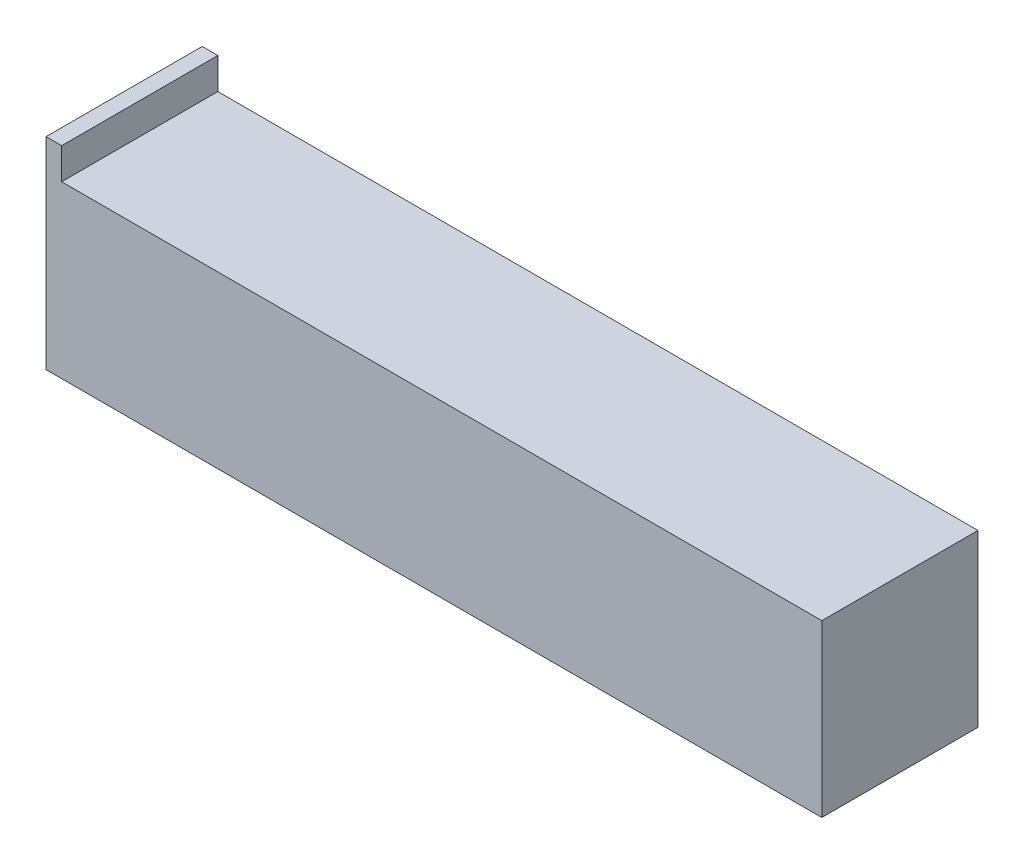
ISO-10303-21;
HEADER;
FILE_DESCRIPTION(('STEP AP214'),'2;1');
FILE_NAME('part.step','',(''),(''),'','','');
FILE_SCHEMA(('AUTOMOTIVE_DESIGN { 1 0 10303 214 1 1 1 1 }'));
ENDSEC;
DATA;
#1=APPLICATION_CONTEXT('core data for automotive mechanical design processes');
#2=APPLICATION_PROTOCOL_DEFINITION('international standard','automotive_design',2000,#1);
#3=PRODUCT_CONTEXT('',#1,'mechanical');
#4=PRODUCT('Part','Part','',(#3));
#5=PRODUCT_RELATED_PRODUCT_CATEGORY('part','',(#4));
#6=PRODUCT_DEFINITION_FORMATION('','',#4);
#7=PRODUCT_DEFINITION_CONTEXT('part definition',#1,'design');
#8=PRODUCT_DEFINITION('design','',#6,#7);
#9=PRODUCT_DEFINITION_SHAPE('','',#8);
#10=(LENGTH_UNIT() NAMED_UNIT(*) SI_UNIT(.MILLI.,.METRE.));
#11=(NAMED_UNIT(*) PLANE_ANGLE_UNIT() SI_UNIT($,.RADIAN.));
#12=(NAMED_UNIT(*) SI_UNIT($,.STERADIAN.) SOLID_ANGLE_UNIT());
#13=UNCERTAINTY_MEASURE_WITH_UNIT(LENGTH_MEASURE(1.E-05),#10,'distance_accuracy_value','');
#14=(GEOMETRIC_REPRESENTATION_CONTEXT(3) GLOBAL_UNCERTAINTY_ASSIGNED_CONTEXT((#13)) GLOBAL_UNIT_ASSIGNED_CONTEXT((#10,
#11,#12)) REPRESENTATION_CONTEXT('',''));
#15=CARTESIAN_POINT('',(0.,0.,0.));
#16=DIRECTION('',(0.,0.,1.));
#17=DIRECTION('',(1.,0.,0.));
#18=AXIS2_PLACEMENT_3D('',#15,#16,#17);
#19=CARTESIAN_POINT('',(75.692,0.,15.24));
#20=DIRECTION('',(1.,0.,0.));
#21=DIRECTION('',(0.,0.,-1.));
#22=AXIS2_PLACEMENT_3D('',#19,#20,#21);
#23=PLANE('',#22);
#24=DIRECTION('',(0.,-1.,0.));
#25=VECTOR('',#24,1.);
#26=CARTESIAN_POINT('',(75.692,0.,0.));
#27=LINE('',#26,#25);
#28=CARTESIAN_POINT('',(75.692,0.,0.));
#29=VERTEX_POINT('',#28);
#30=CARTESIAN_POINT('',(75.692,-16.637,0.));
#31=VERTEX_POINT('',#30);
#32=EDGE_CURVE('E119',#29,#31,#27,.T.);
#33=ORIENTED_EDGE('',*,*,#32,.F.);
#34=DIRECTION('',(0.,0.,-1.));
#35=VECTOR('',#34,1.);
#36=CARTESIAN_POINT('',(75.692,0.,15.24));
#37=LINE('',#36,#35);
#38=CARTESIAN_POINT('',(75.692,0.,15.24));
#39=VERTEX_POINT('',#38);
#40=EDGE_CURVE('E11',#39,#29,#37,.T.);
#41=ORIENTED_EDGE('',*,*,#40,.F.);
#42=DIRECTION('',(0.,-1.,0.));
#43=VECTOR('',#42,1.);
#44=CARTESIAN_POINT('',(75.692,0.,15.24));
#45=LINE('',#44,#43);
#46=CARTESIAN_POINT('',(75.692,-16.637,15.24));
#47=VERTEX_POINT('',#46);
#48=EDGE_CURVE('E132',#39,#47,#45,.T.);
#49=ORIENTED_EDGE('',*,*,#48,.T.);
#50=DIRECTION('',(0.,0.,-1.));
#51=VECTOR('',#50,1.);
#52=CARTESIAN_POINT('',(75.692,-16.637,15.24));
#53=LINE('',#52,#51);
#54=EDGE_CURVE('E81',#47,#31,#53,.T.);
#55=ORIENTED_EDGE('',*,*,#54,.T.);
#56=EDGE_LOOP('',(#33,#41,#49,#55));
#57=FACE_BOUND('',#56,.T.);
#58=ADVANCED_FACE('F37',(#57),#23,.T.);
#59=CARTESIAN_POINT('',(0.,0.,15.24));
#60=DIRECTION('',(0.,1.,0.));
#61=DIRECTION('',(0.,0.,1.));
#62=AXIS2_PLACEMENT_3D('',#59,#60,#61);
#63=PLANE('',#62);
#64=DIRECTION('',(1.,0.,0.));
#65=VECTOR('',#64,1.);
#66=CARTESIAN_POINT('',(0.,0.,0.));
#67=LINE('',#66,#65);
#68=CARTESIAN_POINT('',(1.524,0.,0.));
#69=VERTEX_POINT('',#68);
#70=EDGE_CURVE('E122',#69,#29,#67,.T.);
#71=ORIENTED_EDGE('',*,*,#70,.F.);
#72=DIRECTION('',(0.,0.,-1.));
#73=VECTOR('',#72,1.);
#74=CARTESIAN_POINT('',(1.524,0.,15.24));
#75=LINE('',#74,#73);
#76=CARTESIAN_POINT('',(1.524,0.,15.24));
#77=VERTEX_POINT('',#76);
#78=EDGE_CURVE('E45',#77,#69,#75,.T.);
#79=ORIENTED_EDGE('',*,*,#78,.F.);
#80=DIRECTION('',(1.,0.,0.));
#81=VECTOR('',#80,1.);
#82=CARTESIAN_POINT('',(0.,0.,15.24));
#83=LINE('',#82,#81);
#84=EDGE_CURVE('E114',#77,#39,#83,.T.);
#85=ORIENTED_EDGE('',*,*,#84,.T.);
#86=ORIENTED_EDGE('',*,*,#40,.T.);
#87=EDGE_LOOP('',(#71,#79,#85,#86));
#88=FACE_BOUND('',#87,.T.);
#89=ADVANCED_FACE('F143',(#88),#63,.T.);
#90=CARTESIAN_POINT('',(1.524,0.,15.24));
#91=DIRECTION('',(-1.,0.,0.));
#92=DIRECTION('',(0.,0.,1.));
#93=AXIS2_PLACEMENT_3D('',#90,#91,#92);
#94=PLANE('',#93);
#95=DIRECTION('',(0.,1.,0.));
#96=VECTOR('',#95,1.);
#97=CARTESIAN_POINT('',(1.524,0.,0.));
#98=LINE('',#97,#96);
#99=CARTESIAN_POINT('',(1.524,3.048,0.));
#100=VERTEX_POINT('',#99);
#101=EDGE_CURVE('E125',#69,#100,#98,.T.);
#102=ORIENTED_EDGE('',*,*,#101,.T.);
#103=DIRECTION('',(0.,0.,-1.));
#104=VECTOR('',#103,1.);
#105=CARTESIAN_POINT('',(1.524,3.048,15.24));
#106=LINE('',#105,#104);
#107=CARTESIAN_POINT('',(1.524,3.048,15.24));
#108=VERTEX_POINT('',#107);
#109=EDGE_CURVE('E102',#108,#100,#106,.T.);
#110=ORIENTED_EDGE('',*,*,#109,.F.);
#111=DIRECTION('',(0.,1.,0.));
#112=VECTOR('',#111,1.);
#113=CARTESIAN_POINT('',(1.524,0.,15.24));
#114=LINE('',#113,#112);
#115=EDGE_CURVE('E111',#77,#108,#114,.T.);
#116=ORIENTED_EDGE('',*,*,#115,.F.);
#117=ORIENTED_EDGE('',*,*,#78,.T.);
#118=EDGE_LOOP('',(#102,#110,#116,#117));
#119=FACE_BOUND('',#118,.T.);
#120=ADVANCED_FACE('F137',(#119),#94,.F.);
#121=CARTESIAN_POINT('',(0.,3.048,15.24));
#122=DIRECTION('',(0.,1.,0.));
#123=DIRECTION('',(0.,0.,1.));
#124=AXIS2_PLACEMENT_3D('',#121,#122,#123);
#125=PLANE('',#124);
#126=DIRECTION('',(1.,0.,0.));
#127=VECTOR('',#126,1.);
#128=CARTESIAN_POINT('',(0.,3.048,0.));
#129=LINE('',#128,#127);
#130=CARTESIAN_POINT('',(0.,3.048,0.));
#131=VERTEX_POINT('',#130);
#132=EDGE_CURVE('E101',#131,#100,#129,.T.);
#133=ORIENTED_EDGE('',*,*,#132,.F.);
#134=DIRECTION('',(0.,0.,-1.));
#135=VECTOR('',#134,1.);
#136=CARTESIAN_POINT('',(0.,3.048,15.24));
#137=LINE('',#136,#135);
#138=CARTESIAN_POINT('',(0.,3.048,15.24));
#139=VERTEX_POINT('',#138);
#140=EDGE_CURVE('E95',#139,#131,#137,.T.);
#141=ORIENTED_EDGE('',*,*,#140,.F.);
#142=DIRECTION('',(1.,0.,0.));
#143=VECTOR('',#142,1.);
#144=CARTESIAN_POINT('',(0.,3.048,15.24));
#145=LINE('',#144,#143);
#146=EDGE_CURVE('E99',#139,#108,#145,.T.);
#147=ORIENTED_EDGE('',*,*,#146,.T.);
#148=ORIENTED_EDGE('',*,*,#109,.T.);
#149=EDGE_LOOP('',(#133,#141,#147,#148));
#150=FACE_BOUND('',#149,.T.);
#151=ADVANCED_FACE('F97',(#150),#125,.T.);
#152=CARTESIAN_POINT('',(0.,0.,15.24));
#153=DIRECTION('',(1.,0.,0.));
#154=DIRECTION('',(0.,1.,0.));
#155=AXIS2_PLACEMENT_3D('',#152,#153,#154);
#156=PLANE('',#155);
#157=DIRECTION('',(0.,-1.,0.));
#158=VECTOR('',#157,1.);
#159=CARTESIAN_POINT('',(0.,0.,0.));
#160=LINE('',#159,#158);
#161=CARTESIAN_POINT('',(0.,-16.637,0.));
#162=VERTEX_POINT('',#161);
#163=EDGE_CURVE('E74',#131,#162,#160,.T.);
#164=ORIENTED_EDGE('',*,*,#163,.T.);
#165=DIRECTION('',(0.,0.,-1.));
#166=VECTOR('',#165,1.);
#167=CARTESIAN_POINT('',(0.,-16.637,15.24));
#168=LINE('',#167,#166);
#169=CARTESIAN_POINT('',(0.,-16.637,15.24));
#170=VERTEX_POINT('',#169);
#171=EDGE_CURVE('E103',#170,#162,#168,.T.);
#172=ORIENTED_EDGE('',*,*,#171,.F.);
#173=DIRECTION('',(0.,-1.,0.));
#174=VECTOR('',#173,1.);
#175=CARTESIAN_POINT('',(0.,0.,15.24));
#176=LINE('',#175,#174);
#177=EDGE_CURVE('E105',#139,#170,#176,.T.);
#178=ORIENTED_EDGE('',*,*,#177,.F.);
#179=ORIENTED_EDGE('',*,*,#140,.T.);
#180=EDGE_LOOP('',(#164,#172,#178,#179));
#181=FACE_BOUND('',#180,.T.);
#182=ADVANCED_FACE('F106',(#181),#156,.F.);
#183=CARTESIAN_POINT('',(0.,-16.637,15.24));
#184=DIRECTION('',(0.,1.,0.));
#185=DIRECTION('',(0.,0.,1.));
#186=AXIS2_PLACEMENT_3D('',#183,#184,#185);
#187=PLANE('',#186);
#188=DIRECTION('',(1.,0.,0.));
#189=VECTOR('',#188,1.);
#190=CARTESIAN_POINT('',(0.,-16.637,0.));
#191=LINE('',#190,#189);
#192=EDGE_CURVE('E130',#162,#31,#191,.T.);
#193=ORIENTED_EDGE('',*,*,#192,.T.);
#194=ORIENTED_EDGE('',*,*,#54,.F.);
#195=DIRECTION('',(1.,0.,0.));
#196=VECTOR('',#195,1.);
#197=CARTESIAN_POINT('',(0.,-16.637,15.24));
#198=LINE('',#197,#196);
#199=EDGE_CURVE('E53',#170,#47,#198,.T.);
#200=ORIENTED_EDGE('',*,*,#199,.F.);
#201=ORIENTED_EDGE('',*,*,#171,.T.);
#202=EDGE_LOOP('',(#193,#194,#200,#201));
#203=FACE_BOUND('',#202,.T.);
#204=ADVANCED_FACE('F146',(#203),#187,.F.);
#205=CARTESIAN_POINT('',(0.,0.,15.24));
#206=DIRECTION('',(0.,0.,1.));
#207=DIRECTION('',(1.,0.,0.));
#208=AXIS2_PLACEMENT_3D('',#205,#206,#207);
#209=PLANE('',#208);
#210=ORIENTED_EDGE('',*,*,#48,.F.);
#211=ORIENTED_EDGE('',*,*,#84,.F.);
#212=ORIENTED_EDGE('',*,*,#115,.T.);
#213=ORIENTED_EDGE('',*,*,#146,.F.);
#214=ORIENTED_EDGE('',*,*,#177,.T.);
#215=ORIENTED_EDGE('',*,*,#199,.T.);
#216=EDGE_LOOP('',(#210,#211,#212,#213,#214,#215));
#217=FACE_BOUND('',#216,.T.);
#218=ADVANCED_FACE('F108',(#217),#209,.T.);
#219=CARTESIAN_POINT('',(0.,0.,0.));
#220=DIRECTION('',(0.,0.,1.));
#221=DIRECTION('',(1.,0.,0.));
#222=AXIS2_PLACEMENT_3D('',#219,#220,#221);
#223=PLANE('',#222);
#224=ORIENTED_EDGE('',*,*,#32,.T.);
#225=ORIENTED_EDGE('',*,*,#192,.F.);
#226=ORIENTED_EDGE('',*,*,#163,.F.);
#227=ORIENTED_EDGE('',*,*,#132,.T.);
#228=ORIENTED_EDGE('',*,*,#101,.F.);
#229=ORIENTED_EDGE('',*,*,#70,.T.);
#230=EDGE_LOOP('',(#224,#225,#226,#227,#228,#229));
#231=FACE_BOUND('',#230,.T.);
#232=ADVANCED_FACE('F142',(#231),#223,.F.);
#233=CLOSED_SHELL('',(#58,#89,#120,#151,#182,#204,#218,#232));
#234=MANIFOLD_SOLID_BREP('B2',#233);
#235=ADVANCED_BREP_SHAPE_REPRESENTATION('',(#18,#234),#14);
#236=SHAPE_DEFINITION_REPRESENTATION(#9,#235);
ENDSEC;
END-ISO-10303-21;
